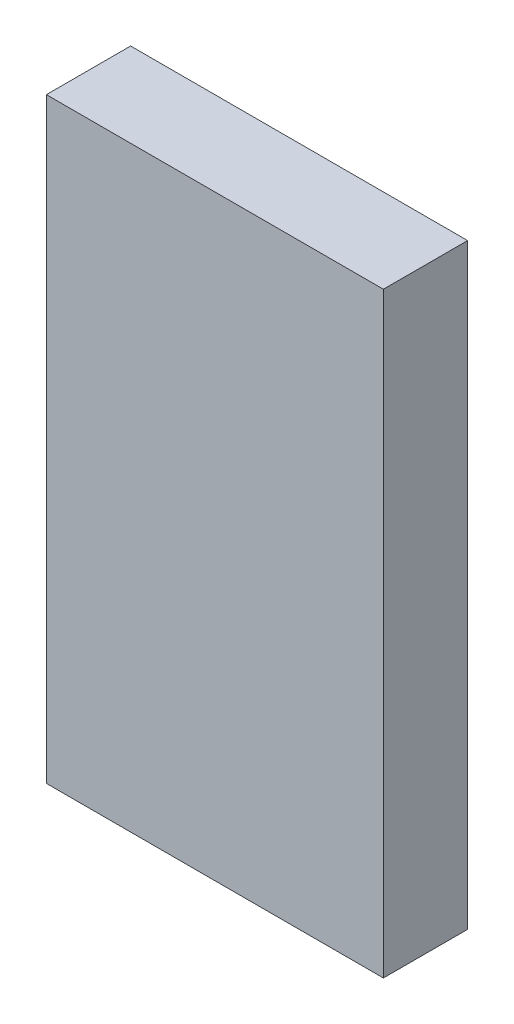
ISO-10303-21;
HEADER;
FILE_DESCRIPTION(('STEP AP214'),'2;1');
FILE_NAME('part.step','',(''),(''),'','','');
FILE_SCHEMA(('AUTOMOTIVE_DESIGN { 1 0 10303 214 1 1 1 1 }'));
ENDSEC;
DATA;
#1=APPLICATION_CONTEXT('core data for automotive mechanical design processes');
#2=APPLICATION_PROTOCOL_DEFINITION('international standard','automotive_design',2000,#1);
#3=PRODUCT_CONTEXT('',#1,'mechanical');
#4=PRODUCT('Part','Part','',(#3));
#5=PRODUCT_RELATED_PRODUCT_CATEGORY('part','',(#4));
#6=PRODUCT_DEFINITION_FORMATION('','',#4);
#7=PRODUCT_DEFINITION_CONTEXT('part definition',#1,'design');
#8=PRODUCT_DEFINITION('design','',#6,#7);
#9=PRODUCT_DEFINITION_SHAPE('','',#8);
#10=(LENGTH_UNIT() NAMED_UNIT(*) SI_UNIT(.MILLI.,.METRE.));
#11=(NAMED_UNIT(*) PLANE_ANGLE_UNIT() SI_UNIT($,.RADIAN.));
#12=(NAMED_UNIT(*) SI_UNIT($,.STERADIAN.) SOLID_ANGLE_UNIT());
#13=UNCERTAINTY_MEASURE_WITH_UNIT(LENGTH_MEASURE(1.E-05),#10,'distance_accuracy_value','');
#14=(GEOMETRIC_REPRESENTATION_CONTEXT(3) GLOBAL_UNCERTAINTY_ASSIGNED_CONTEXT((#13)) GLOBAL_UNIT_ASSIGNED_CONTEXT((#10,
#11,#12)) REPRESENTATION_CONTEXT('',''));
#15=CARTESIAN_POINT('',(0.,0.,0.));
#16=DIRECTION('',(0.,0.,1.));
#17=DIRECTION('',(1.,0.,0.));
#18=AXIS2_PLACEMENT_3D('',#15,#16,#17);
#19=CARTESIAN_POINT('',(0.,22.479,0.));
#20=DIRECTION('',(1.,0.,0.));
#21=DIRECTION('',(0.,0.,-1.));
#22=AXIS2_PLACEMENT_3D('',#19,#20,#21);
#23=PLANE('',#22);
#24=DIRECTION('',(0.,0.,1.));
#25=VECTOR('',#24,1.);
#26=CARTESIAN_POINT('',(0.,0.,0.));
#27=LINE('',#26,#25);
#28=CARTESIAN_POINT('',(0.,0.,-3.175));
#29=VERTEX_POINT('',#28);
#30=CARTESIAN_POINT('',(0.,0.,0.));
#31=VERTEX_POINT('',#30);
#32=EDGE_CURVE('E95',#29,#31,#27,.T.);
#33=ORIENTED_EDGE('',*,*,#32,.T.);
#34=DIRECTION('',(0.,-1.,0.));
#35=VECTOR('',#34,1.);
#36=CARTESIAN_POINT('',(0.,22.479,0.));
#37=LINE('',#36,#35);
#38=CARTESIAN_POINT('',(0.,22.479,0.));
#39=VERTEX_POINT('',#38);
#40=EDGE_CURVE('E11',#39,#31,#37,.T.);
#41=ORIENTED_EDGE('',*,*,#40,.F.);
#42=DIRECTION('',(0.,0.,1.));
#43=VECTOR('',#42,1.);
#44=CARTESIAN_POINT('',(0.,22.479,0.));
#45=LINE('',#44,#43);
#46=CARTESIAN_POINT('',(0.,22.479,-3.175));
#47=VERTEX_POINT('',#46);
#48=EDGE_CURVE('E83',#47,#39,#45,.T.);
#49=ORIENTED_EDGE('',*,*,#48,.F.);
#50=DIRECTION('',(0.,-1.,0.));
#51=VECTOR('',#50,1.);
#52=CARTESIAN_POINT('',(0.,22.479,-3.175));
#53=LINE('',#52,#51);
#54=EDGE_CURVE('E91',#47,#29,#53,.T.);
#55=ORIENTED_EDGE('',*,*,#54,.T.);
#56=EDGE_LOOP('',(#33,#41,#49,#55));
#57=FACE_BOUND('',#56,.T.);
#58=ADVANCED_FACE('F32',(#57),#23,.F.);
#59=CARTESIAN_POINT('',(0.,22.479,0.));
#60=DIRECTION('',(0.,0.,-1.));
#61=DIRECTION('',(-1.,0.,0.));
#62=AXIS2_PLACEMENT_3D('',#59,#60,#61);
#63=PLANE('',#62);
#64=DIRECTION('',(1.,0.,0.));
#65=VECTOR('',#64,1.);
#66=CARTESIAN_POINT('',(0.,0.,0.));
#67=LINE('',#66,#65);
#68=CARTESIAN_POINT('',(12.7,0.,0.));
#69=VERTEX_POINT('',#68);
#70=EDGE_CURVE('E87',#31,#69,#67,.T.);
#71=ORIENTED_EDGE('',*,*,#70,.T.);
#72=DIRECTION('',(0.,-1.,0.));
#73=VECTOR('',#72,1.);
#74=CARTESIAN_POINT('',(12.7,22.479,0.));
#75=LINE('',#74,#73);
#76=CARTESIAN_POINT('',(12.7,22.479,0.));
#77=VERTEX_POINT('',#76);
#78=EDGE_CURVE('E40',#77,#69,#75,.T.);
#79=ORIENTED_EDGE('',*,*,#78,.F.);
#80=DIRECTION('',(1.,0.,0.));
#81=VECTOR('',#80,1.);
#82=CARTESIAN_POINT('',(0.,22.479,0.));
#83=LINE('',#82,#81);
#84=EDGE_CURVE('E78',#39,#77,#83,.T.);
#85=ORIENTED_EDGE('',*,*,#84,.F.);
#86=ORIENTED_EDGE('',*,*,#40,.T.);
#87=EDGE_LOOP('',(#71,#79,#85,#86));
#88=FACE_BOUND('',#87,.T.);
#89=ADVANCED_FACE('F86',(#88),#63,.F.);
#90=CARTESIAN_POINT('',(12.7,22.479,0.));
#91=DIRECTION('',(-1.,0.,0.));
#92=DIRECTION('',(0.,0.,1.));
#93=AXIS2_PLACEMENT_3D('',#90,#91,#92);
#94=PLANE('',#93);
#95=DIRECTION('',(0.,0.,-1.));
#96=VECTOR('',#95,1.);
#97=CARTESIAN_POINT('',(12.7,0.,0.));
#98=LINE('',#97,#96);
#99=CARTESIAN_POINT('',(12.7,0.,-3.175));
#100=VERTEX_POINT('',#99);
#101=EDGE_CURVE('E65',#69,#100,#98,.T.);
#102=ORIENTED_EDGE('',*,*,#101,.T.);
#103=DIRECTION('',(0.,-1.,0.));
#104=VECTOR('',#103,1.);
#105=CARTESIAN_POINT('',(12.7,22.479,-3.175));
#106=LINE('',#105,#104);
#107=CARTESIAN_POINT('',(12.7,22.479,-3.175));
#108=VERTEX_POINT('',#107);
#109=EDGE_CURVE('E88',#108,#100,#106,.T.);
#110=ORIENTED_EDGE('',*,*,#109,.F.);
#111=DIRECTION('',(0.,0.,-1.));
#112=VECTOR('',#111,1.);
#113=CARTESIAN_POINT('',(12.7,22.479,0.));
#114=LINE('',#113,#112);
#115=EDGE_CURVE('E81',#77,#108,#114,.T.);
#116=ORIENTED_EDGE('',*,*,#115,.F.);
#117=ORIENTED_EDGE('',*,*,#78,.T.);
#118=EDGE_LOOP('',(#102,#110,#116,#117));
#119=FACE_BOUND('',#118,.T.);
#120=ADVANCED_FACE('F89',(#119),#94,.F.);
#121=CARTESIAN_POINT('',(0.,22.479,-3.175));
#122=DIRECTION('',(0.,0.,1.));
#123=DIRECTION('',(1.,0.,0.));
#124=AXIS2_PLACEMENT_3D('',#121,#122,#123);
#125=PLANE('',#124);
#126=DIRECTION('',(-1.,0.,0.));
#127=VECTOR('',#126,1.);
#128=CARTESIAN_POINT('',(0.,0.,-3.175));
#129=LINE('',#128,#127);
#130=EDGE_CURVE('E71',#100,#29,#129,.T.);
#131=ORIENTED_EDGE('',*,*,#130,.T.);
#132=ORIENTED_EDGE('',*,*,#54,.F.);
#133=DIRECTION('',(-1.,0.,0.));
#134=VECTOR('',#133,1.);
#135=CARTESIAN_POINT('',(0.,22.479,-3.175));
#136=LINE('',#135,#134);
#137=EDGE_CURVE('E48',#108,#47,#136,.T.);
#138=ORIENTED_EDGE('',*,*,#137,.F.);
#139=ORIENTED_EDGE('',*,*,#109,.T.);
#140=EDGE_LOOP('',(#131,#132,#138,#139));
#141=FACE_BOUND('',#140,.T.);
#142=ADVANCED_FACE('F102',(#141),#125,.F.);
#143=CARTESIAN_POINT('',(0.,22.479,0.));
#144=DIRECTION('',(0.,-1.,0.));
#145=DIRECTION('',(0.,0.,-1.));
#146=AXIS2_PLACEMENT_3D('',#143,#144,#145);
#147=PLANE('',#146);
#148=ORIENTED_EDGE('',*,*,#48,.T.);
#149=ORIENTED_EDGE('',*,*,#84,.T.);
#150=ORIENTED_EDGE('',*,*,#115,.T.);
#151=ORIENTED_EDGE('',*,*,#137,.T.);
#152=EDGE_LOOP('',(#148,#149,#150,#151));
#153=FACE_BOUND('',#152,.T.);
#154=ADVANCED_FACE('F79',(#153),#147,.F.);
#155=CARTESIAN_POINT('',(0.,0.,0.));
#156=DIRECTION('',(0.,-1.,0.));
#157=DIRECTION('',(0.,0.,-1.));
#158=AXIS2_PLACEMENT_3D('',#155,#156,#157);
#159=PLANE('',#158);
#160=ORIENTED_EDGE('',*,*,#32,.F.);
#161=ORIENTED_EDGE('',*,*,#130,.F.);
#162=ORIENTED_EDGE('',*,*,#101,.F.);
#163=ORIENTED_EDGE('',*,*,#70,.F.);
#164=EDGE_LOOP('',(#160,#161,#162,#163));
#165=FACE_BOUND('',#164,.T.);
#166=ADVANCED_FACE('F105',(#165),#159,.T.);
#167=CLOSED_SHELL('',(#58,#89,#120,#142,#154,#166));
#168=MANIFOLD_SOLID_BREP('B2',#167);
#169=ADVANCED_BREP_SHAPE_REPRESENTATION('',(#18,#168),#14);
#170=SHAPE_DEFINITION_REPRESENTATION(#9,#169);
ENDSEC;
END-ISO-10303-21;
